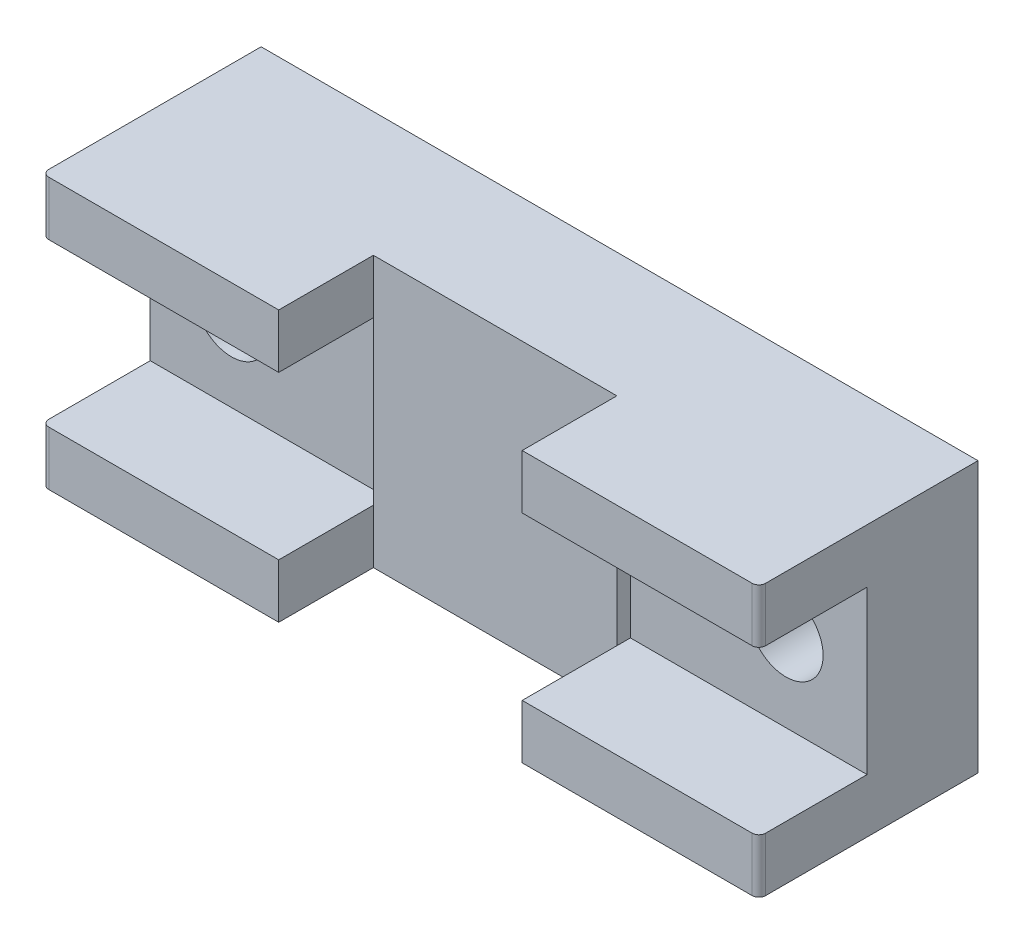
ISO-10303-21;
HEADER;
FILE_DESCRIPTION(('STEP AP214'),'2;1');
FILE_NAME('part.step','',(''),(''),'','','');
FILE_SCHEMA(('AUTOMOTIVE_DESIGN { 1 0 10303 214 1 1 1 1 }'));
ENDSEC;
DATA;
#1=APPLICATION_CONTEXT('core data for automotive mechanical design processes');
#2=APPLICATION_PROTOCOL_DEFINITION('international standard','automotive_design',2000,#1);
#3=PRODUCT_CONTEXT('',#1,'mechanical');
#4=PRODUCT('Part','Part','',(#3));
#5=PRODUCT_RELATED_PRODUCT_CATEGORY('part','',(#4));
#6=PRODUCT_DEFINITION_FORMATION('','',#4);
#7=PRODUCT_DEFINITION_CONTEXT('part definition',#1,'design');
#8=PRODUCT_DEFINITION('design','',#6,#7);
#9=PRODUCT_DEFINITION_SHAPE('','',#8);
#10=(LENGTH_UNIT() NAMED_UNIT(*) SI_UNIT(.MILLI.,.METRE.));
#11=(NAMED_UNIT(*) PLANE_ANGLE_UNIT() SI_UNIT($,.RADIAN.));
#12=(NAMED_UNIT(*) SI_UNIT($,.STERADIAN.) SOLID_ANGLE_UNIT());
#13=UNCERTAINTY_MEASURE_WITH_UNIT(LENGTH_MEASURE(1.E-05),#10,'distance_accuracy_value','');
#14=(GEOMETRIC_REPRESENTATION_CONTEXT(3) GLOBAL_UNCERTAINTY_ASSIGNED_CONTEXT((#13)) GLOBAL_UNIT_ASSIGNED_CONTEXT((#10,
#11,#12)) REPRESENTATION_CONTEXT('',''));
#15=CARTESIAN_POINT('',(0.,0.,0.));
#16=DIRECTION('',(0.,0.,1.));
#17=DIRECTION('',(1.,0.,0.));
#18=AXIS2_PLACEMENT_3D('',#15,#16,#17);
#19=CARTESIAN_POINT('',(0.,0.,8.2));
#20=DIRECTION('',(0.,0.,1.));
#21=DIRECTION('',(1.,0.,0.));
#22=AXIS2_PLACEMENT_3D('',#19,#20,#21);
#23=PLANE('',#22);
#24=CARTESIAN_POINT('',(-20.5,0.,8.2));
#25=DIRECTION('',(0.,0.,1.));
#26=DIRECTION('',(-1.,0.,0.));
#27=AXIS2_PLACEMENT_3D('',#24,#25,#26);
#28=CIRCLE('',#27,2.75);
#29=CARTESIAN_POINT('',(-23.25,0.,8.2));
#30=VERTEX_POINT('',#29);
#31=EDGE_CURVE('E312',#30,#30,#28,.T.);
#32=ORIENTED_EDGE('',*,*,#31,.F.);
#33=EDGE_LOOP('',(#32));
#34=FACE_BOUND('',#33,.T.);
#35=DIRECTION('',(0.,-1.,0.));
#36=VECTOR('',#35,1.);
#37=CARTESIAN_POINT('',(-26.5,10.,8.2));
#38=LINE('',#37,#36);
#39=CARTESIAN_POINT('',(-26.5,6.,8.2));
#40=VERTEX_POINT('',#39);
#41=CARTESIAN_POINT('',(-26.5,-6.,8.2));
#42=VERTEX_POINT('',#41);
#43=EDGE_CURVE('E196',#40,#42,#38,.T.);
#44=ORIENTED_EDGE('',*,*,#43,.T.);
#45=DIRECTION('',(-1.,0.,0.));
#46=VECTOR('',#45,1.);
#47=CARTESIAN_POINT('',(-26.5,-6.,8.2));
#48=LINE('',#47,#46);
#49=CARTESIAN_POINT('',(-9.,-6.,8.2));
#50=VERTEX_POINT('',#49);
#51=EDGE_CURVE('E205',#50,#42,#48,.T.);
#52=ORIENTED_EDGE('',*,*,#51,.F.);
#53=DIRECTION('',(0.,-1.,0.));
#54=VECTOR('',#53,1.);
#55=CARTESIAN_POINT('',(-9.,10.,8.2));
#56=LINE('',#55,#54);
#57=CARTESIAN_POINT('',(-9.,6.,8.2));
#58=VERTEX_POINT('',#57);
#59=EDGE_CURVE('E333',#58,#50,#56,.T.);
#60=ORIENTED_EDGE('',*,*,#59,.F.);
#61=DIRECTION('',(1.,0.,0.));
#62=VECTOR('',#61,1.);
#63=CARTESIAN_POINT('',(-26.5,6.,8.2));
#64=LINE('',#63,#62);
#65=EDGE_CURVE('E217',#40,#58,#64,.T.);
#66=ORIENTED_EDGE('',*,*,#65,.F.);
#67=EDGE_LOOP('',(#44,#52,#60,#66));
#68=FACE_BOUND('',#67,.T.);
#69=ADVANCED_FACE('F43',(#34,#68),#23,.T.);
#70=CARTESIAN_POINT('',(-9.,10.,9.2));
#71=DIRECTION('',(1.,0.,0.));
#72=DIRECTION('',(0.,0.,-1.));
#73=AXIS2_PLACEMENT_3D('',#70,#71,#72);
#74=PLANE('',#73);
#75=DIRECTION('',(0.,0.,-1.));
#76=VECTOR('',#75,1.);
#77=CARTESIAN_POINT('',(-9.,-6.,16.2));
#78=LINE('',#77,#76);
#79=CARTESIAN_POINT('',(-9.,-6.,9.2));
#80=VERTEX_POINT('',#79);
#81=EDGE_CURVE('E209',#80,#50,#78,.T.);
#82=ORIENTED_EDGE('',*,*,#81,.F.);
#83=DIRECTION('',(0.,-1.,0.));
#84=VECTOR('',#83,1.);
#85=CARTESIAN_POINT('',(-9.,10.,9.2));
#86=LINE('',#85,#84);
#87=CARTESIAN_POINT('',(-9.,6.,9.2));
#88=VERTEX_POINT('',#87);
#89=EDGE_CURVE('E329',#88,#80,#86,.T.);
#90=ORIENTED_EDGE('',*,*,#89,.F.);
#91=DIRECTION('',(0.,0.,-1.));
#92=VECTOR('',#91,1.);
#93=CARTESIAN_POINT('',(-9.,6.,16.2));
#94=LINE('',#93,#92);
#95=EDGE_CURVE('E393',#88,#58,#94,.T.);
#96=ORIENTED_EDGE('',*,*,#95,.T.);
#97=ORIENTED_EDGE('',*,*,#59,.T.);
#98=EDGE_LOOP('',(#82,#90,#96,#97));
#99=FACE_BOUND('',#98,.T.);
#100=ADVANCED_FACE('F396',(#99),#74,.F.);
#101=CARTESIAN_POINT('',(20.5,0.,8.2));
#102=DIRECTION('',(0.,0.,1.));
#103=DIRECTION('',(1.,0.,0.));
#104=AXIS2_PLACEMENT_3D('',#101,#102,#103);
#105=CIRCLE('',#104,2.75);
#106=CARTESIAN_POINT('',(23.25,0.,8.2));
#107=VERTEX_POINT('',#106);
#108=EDGE_CURVE('E309',#107,#107,#105,.T.);
#109=ORIENTED_EDGE('',*,*,#108,.F.);
#110=EDGE_LOOP('',(#109));
#111=FACE_BOUND('',#110,.T.);
#112=DIRECTION('',(0.,1.,0.));
#113=VECTOR('',#112,1.);
#114=CARTESIAN_POINT('',(26.5,10.,8.2));
#115=LINE('',#114,#113);
#116=CARTESIAN_POINT('',(26.5,-6.,8.2));
#117=VERTEX_POINT('',#116);
#118=CARTESIAN_POINT('',(26.5,6.,8.2));
#119=VERTEX_POINT('',#118);
#120=EDGE_CURVE('E219',#117,#119,#115,.T.);
#121=ORIENTED_EDGE('',*,*,#120,.T.);
#122=DIRECTION('',(1.,0.,0.));
#123=VECTOR('',#122,1.);
#124=CARTESIAN_POINT('',(26.5,6.,8.2));
#125=LINE('',#124,#123);
#126=CARTESIAN_POINT('',(9.,6.,8.2));
#127=VERTEX_POINT('',#126);
#128=EDGE_CURVE('E290',#127,#119,#125,.T.);
#129=ORIENTED_EDGE('',*,*,#128,.F.);
#130=DIRECTION('',(0.,1.,0.));
#131=VECTOR('',#130,1.);
#132=CARTESIAN_POINT('',(9.,10.,8.2));
#133=LINE('',#132,#131);
#134=CARTESIAN_POINT('',(9.,-6.,8.2));
#135=VERTEX_POINT('',#134);
#136=EDGE_CURVE('E308',#135,#127,#133,.T.);
#137=ORIENTED_EDGE('',*,*,#136,.F.);
#138=DIRECTION('',(-1.,0.,0.));
#139=VECTOR('',#138,1.);
#140=CARTESIAN_POINT('',(26.5,-6.,8.2));
#141=LINE('',#140,#139);
#142=EDGE_CURVE('E287',#117,#135,#141,.T.);
#143=ORIENTED_EDGE('',*,*,#142,.F.);
#144=EDGE_LOOP('',(#121,#129,#137,#143));
#145=FACE_BOUND('',#144,.T.);
#146=ADVANCED_FACE('F411',(#111,#145),#23,.T.);
#147=CARTESIAN_POINT('',(9.,10.,9.2));
#148=DIRECTION('',(-1.,0.,0.));
#149=DIRECTION('',(0.,0.,1.));
#150=AXIS2_PLACEMENT_3D('',#147,#148,#149);
#151=PLANE('',#150);
#152=DIRECTION('',(0.,0.,-1.));
#153=VECTOR('',#152,1.);
#154=CARTESIAN_POINT('',(9.,6.,16.2));
#155=LINE('',#154,#153);
#156=CARTESIAN_POINT('',(9.,6.,9.2));
#157=VERTEX_POINT('',#156);
#158=EDGE_CURVE('E347',#157,#127,#155,.T.);
#159=ORIENTED_EDGE('',*,*,#158,.F.);
#160=DIRECTION('',(0.,1.,0.));
#161=VECTOR('',#160,1.);
#162=CARTESIAN_POINT('',(9.,10.,9.2));
#163=LINE('',#162,#161);
#164=CARTESIAN_POINT('',(9.,-6.,9.2));
#165=VERTEX_POINT('',#164);
#166=EDGE_CURVE('E321',#165,#157,#163,.T.);
#167=ORIENTED_EDGE('',*,*,#166,.F.);
#168=DIRECTION('',(0.,0.,-1.));
#169=VECTOR('',#168,1.);
#170=CARTESIAN_POINT('',(9.,-6.,16.2));
#171=LINE('',#170,#169);
#172=EDGE_CURVE('E300',#165,#135,#171,.T.);
#173=ORIENTED_EDGE('',*,*,#172,.T.);
#174=ORIENTED_EDGE('',*,*,#136,.T.);
#175=EDGE_LOOP('',(#159,#167,#173,#174));
#176=FACE_BOUND('',#175,.T.);
#177=ADVANCED_FACE('F345',(#176),#151,.F.);
#178=CARTESIAN_POINT('',(26.5,10.,8.2));
#179=DIRECTION('',(-1.,0.,0.));
#180=DIRECTION('',(0.,-1.,0.));
#181=AXIS2_PLACEMENT_3D('',#178,#179,#180);
#182=PLANE('',#181);
#183=DIRECTION('',(0.,0.,-1.));
#184=VECTOR('',#183,1.);
#185=CARTESIAN_POINT('',(26.5,10.,8.2));
#186=LINE('',#185,#184);
#187=CARTESIAN_POINT('',(26.5,10.,15.7));
#188=VERTEX_POINT('',#187);
#189=CARTESIAN_POINT('',(26.5,10.,0.));
#190=VERTEX_POINT('',#189);
#191=EDGE_CURVE('E243',#188,#190,#186,.T.);
#192=ORIENTED_EDGE('',*,*,#191,.F.);
#193=DIRECTION('',(0.,1.,0.));
#194=VECTOR('',#193,1.);
#195=CARTESIAN_POINT('',(26.5,6.,15.7));
#196=LINE('',#195,#194);
#197=CARTESIAN_POINT('',(26.5,6.,15.7));
#198=VERTEX_POINT('',#197);
#199=EDGE_CURVE('E271',#188,#198,#196,.F.);
#200=ORIENTED_EDGE('',*,*,#199,.T.);
#201=DIRECTION('',(0.,0.,-1.));
#202=VECTOR('',#201,1.);
#203=CARTESIAN_POINT('',(26.5,6.,16.2));
#204=LINE('',#203,#202);
#205=EDGE_CURVE('E355',#198,#119,#204,.T.);
#206=ORIENTED_EDGE('',*,*,#205,.T.);
#207=ORIENTED_EDGE('',*,*,#120,.F.);
#208=DIRECTION('',(0.,0.,-1.));
#209=VECTOR('',#208,1.);
#210=CARTESIAN_POINT('',(26.5,-6.,16.2));
#211=LINE('',#210,#209);
#212=CARTESIAN_POINT('',(26.5,-6.,15.7));
#213=VERTEX_POINT('',#212);
#214=EDGE_CURVE('E302',#213,#117,#211,.T.);
#215=ORIENTED_EDGE('',*,*,#214,.F.);
#216=DIRECTION('',(0.,1.,0.));
#217=VECTOR('',#216,1.);
#218=CARTESIAN_POINT('',(26.5,-10.,15.7));
#219=LINE('',#218,#217);
#220=CARTESIAN_POINT('',(26.5,-10.,15.7));
#221=VERTEX_POINT('',#220);
#222=EDGE_CURVE('E269',#213,#221,#219,.F.);
#223=ORIENTED_EDGE('',*,*,#222,.T.);
#224=DIRECTION('',(0.,0.,-1.));
#225=VECTOR('',#224,1.);
#226=CARTESIAN_POINT('',(26.5,-10.,8.2));
#227=LINE('',#226,#225);
#228=CARTESIAN_POINT('',(26.5,-10.,0.));
#229=VERTEX_POINT('',#228);
#230=EDGE_CURVE('E218',#221,#229,#227,.T.);
#231=ORIENTED_EDGE('',*,*,#230,.T.);
#232=DIRECTION('',(0.,1.,0.));
#233=VECTOR('',#232,1.);
#234=CARTESIAN_POINT('',(26.5,10.,0.));
#235=LINE('',#234,#233);
#236=EDGE_CURVE('E228',#229,#190,#235,.T.);
#237=ORIENTED_EDGE('',*,*,#236,.T.);
#238=EDGE_LOOP('',(#192,#200,#206,#207,#215,#223,#231,#237));
#239=FACE_BOUND('',#238,.T.);
#240=ADVANCED_FACE('F414',(#239),#182,.F.);
#241=CARTESIAN_POINT('',(-26.5,10.,8.2));
#242=DIRECTION('',(0.,-1.,0.));
#243=DIRECTION('',(0.,0.,-1.));
#244=AXIS2_PLACEMENT_3D('',#241,#242,#243);
#245=PLANE('',#244);
#246=DIRECTION('',(0.,0.,-1.));
#247=VECTOR('',#246,1.);
#248=CARTESIAN_POINT('',(-26.5,10.,8.2));
#249=LINE('',#248,#247);
#250=CARTESIAN_POINT('',(-26.5,10.,15.7));
#251=VERTEX_POINT('',#250);
#252=CARTESIAN_POINT('',(-26.5,10.,0.));
#253=VERTEX_POINT('',#252);
#254=EDGE_CURVE('E241',#251,#253,#249,.T.);
#255=ORIENTED_EDGE('',*,*,#254,.F.);
#256=CARTESIAN_POINT('',(-26.,10.,15.7));
#257=DIRECTION('',(0.,-1.,0.));
#258=DIRECTION('',(0.,0.,-1.));
#259=AXIS2_PLACEMENT_3D('',#256,#257,#258);
#260=CIRCLE('',#259,0.5);
#261=CARTESIAN_POINT('',(-26.,10.,16.2));
#262=VERTEX_POINT('',#261);
#263=EDGE_CURVE('E264',#251,#262,#260,.F.);
#264=ORIENTED_EDGE('',*,*,#263,.T.);
#265=DIRECTION('',(-1.,0.,0.));
#266=VECTOR('',#265,1.);
#267=CARTESIAN_POINT('',(-26.5,10.,16.2));
#268=LINE('',#267,#266);
#269=CARTESIAN_POINT('',(-9.,10.,16.2));
#270=VERTEX_POINT('',#269);
#271=EDGE_CURVE('E506',#270,#262,#268,.T.);
#272=ORIENTED_EDGE('',*,*,#271,.F.);
#273=DIRECTION('',(0.,0.,-1.));
#274=VECTOR('',#273,1.);
#275=CARTESIAN_POINT('',(-9.,10.,16.2));
#276=LINE('',#275,#274);
#277=CARTESIAN_POINT('',(-9.,10.,9.2));
#278=VERTEX_POINT('',#277);
#279=EDGE_CURVE('E380',#270,#278,#276,.T.);
#280=ORIENTED_EDGE('',*,*,#279,.T.);
#281=DIRECTION('',(-1.,0.,0.));
#282=VECTOR('',#281,1.);
#283=CARTESIAN_POINT('',(-9.,10.,9.2));
#284=LINE('',#283,#282);
#285=CARTESIAN_POINT('',(9.,10.,9.2));
#286=VERTEX_POINT('',#285);
#287=EDGE_CURVE('E320',#286,#278,#284,.T.);
#288=ORIENTED_EDGE('',*,*,#287,.F.);
#289=DIRECTION('',(0.,0.,-1.));
#290=VECTOR('',#289,1.);
#291=CARTESIAN_POINT('',(9.,10.,16.2));
#292=LINE('',#291,#290);
#293=CARTESIAN_POINT('',(9.,10.,16.2));
#294=VERTEX_POINT('',#293);
#295=EDGE_CURVE('E353',#294,#286,#292,.T.);
#296=ORIENTED_EDGE('',*,*,#295,.F.);
#297=DIRECTION('',(-1.,0.,0.));
#298=VECTOR('',#297,1.);
#299=CARTESIAN_POINT('',(26.5,10.,16.2));
#300=LINE('',#299,#298);
#301=CARTESIAN_POINT('',(26.,10.,16.2));
#302=VERTEX_POINT('',#301);
#303=EDGE_CURVE('E293',#302,#294,#300,.T.);
#304=ORIENTED_EDGE('',*,*,#303,.F.);
#305=CARTESIAN_POINT('',(26.,10.,15.7));
#306=DIRECTION('',(0.,-1.,0.));
#307=DIRECTION('',(0.,0.,-1.));
#308=AXIS2_PLACEMENT_3D('',#305,#306,#307);
#309=CIRCLE('',#308,0.5);
#310=EDGE_CURVE('E262',#302,#188,#309,.F.);
#311=ORIENTED_EDGE('',*,*,#310,.T.);
#312=ORIENTED_EDGE('',*,*,#191,.T.);
#313=DIRECTION('',(-1.,0.,0.));
#314=VECTOR('',#313,1.);
#315=CARTESIAN_POINT('',(-26.5,10.,0.));
#316=LINE('',#315,#314);
#317=EDGE_CURVE('E231',#190,#253,#316,.T.);
#318=ORIENTED_EDGE('',*,*,#317,.T.);
#319=EDGE_LOOP('',(#255,#264,#272,#280,#288,#296,#304,#311,#312,#318));
#320=FACE_BOUND('',#319,.T.);
#321=ADVANCED_FACE('F376',(#320),#245,.F.);
#322=CARTESIAN_POINT('',(-26.5,10.,8.2));
#323=DIRECTION('',(1.,0.,0.));
#324=DIRECTION('',(0.,1.,0.));
#325=AXIS2_PLACEMENT_3D('',#322,#323,#324);
#326=PLANE('',#325);
#327=DIRECTION('',(0.,0.,-1.));
#328=VECTOR('',#327,1.);
#329=CARTESIAN_POINT('',(-26.5,-10.,8.2));
#330=LINE('',#329,#328);
#331=CARTESIAN_POINT('',(-26.5,-10.,15.7));
#332=VERTEX_POINT('',#331);
#333=CARTESIAN_POINT('',(-26.5,-10.,0.));
#334=VERTEX_POINT('',#333);
#335=EDGE_CURVE('E221',#332,#334,#330,.T.);
#336=ORIENTED_EDGE('',*,*,#335,.F.);
#337=DIRECTION('',(0.,-1.,0.));
#338=VECTOR('',#337,1.);
#339=CARTESIAN_POINT('',(-26.5,-6.,15.7));
#340=LINE('',#339,#338);
#341=CARTESIAN_POINT('',(-26.5,-6.,15.7));
#342=VERTEX_POINT('',#341);
#343=EDGE_CURVE('E198',#332,#342,#340,.F.);
#344=ORIENTED_EDGE('',*,*,#343,.T.);
#345=DIRECTION('',(0.,0.,-1.));
#346=VECTOR('',#345,1.);
#347=CARTESIAN_POINT('',(-26.5,-6.,16.2));
#348=LINE('',#347,#346);
#349=EDGE_CURVE('E190',#342,#42,#348,.T.);
#350=ORIENTED_EDGE('',*,*,#349,.T.);
#351=ORIENTED_EDGE('',*,*,#43,.F.);
#352=DIRECTION('',(0.,0.,-1.));
#353=VECTOR('',#352,1.);
#354=CARTESIAN_POINT('',(-26.5,6.,16.2));
#355=LINE('',#354,#353);
#356=CARTESIAN_POINT('',(-26.5,6.,15.7));
#357=VERTEX_POINT('',#356);
#358=EDGE_CURVE('E213',#357,#40,#355,.T.);
#359=ORIENTED_EDGE('',*,*,#358,.F.);
#360=DIRECTION('',(0.,-1.,0.));
#361=VECTOR('',#360,1.);
#362=CARTESIAN_POINT('',(-26.5,10.,15.7));
#363=LINE('',#362,#361);
#364=EDGE_CURVE('E252',#357,#251,#363,.F.);
#365=ORIENTED_EDGE('',*,*,#364,.T.);
#366=ORIENTED_EDGE('',*,*,#254,.T.);
#367=DIRECTION('',(0.,-1.,0.));
#368=VECTOR('',#367,1.);
#369=CARTESIAN_POINT('',(-26.5,10.,0.));
#370=LINE('',#369,#368);
#371=EDGE_CURVE('E235',#253,#334,#370,.T.);
#372=ORIENTED_EDGE('',*,*,#371,.T.);
#373=EDGE_LOOP('',(#336,#344,#350,#351,#359,#365,#366,#372));
#374=FACE_BOUND('',#373,.T.);
#375=ADVANCED_FACE('F193',(#374),#326,.F.);
#376=CARTESIAN_POINT('',(-26.5,-10.,8.2));
#377=DIRECTION('',(0.,1.,0.));
#378=DIRECTION('',(0.,0.,1.));
#379=AXIS2_PLACEMENT_3D('',#376,#377,#378);
#380=PLANE('',#379);
#381=DIRECTION('',(1.,0.,0.));
#382=VECTOR('',#381,1.);
#383=CARTESIAN_POINT('',(-26.5,-10.,16.2));
#384=LINE('',#383,#382);
#385=CARTESIAN_POINT('',(-26.,-10.,16.2));
#386=VERTEX_POINT('',#385);
#387=CARTESIAN_POINT('',(-9.,-10.,16.2));
#388=VERTEX_POINT('',#387);
#389=EDGE_CURVE('E214',#386,#388,#384,.T.);
#390=ORIENTED_EDGE('',*,*,#389,.F.);
#391=CARTESIAN_POINT('',(-26.,-10.,15.7));
#392=DIRECTION('',(0.,1.,0.));
#393=DIRECTION('',(0.,0.,1.));
#394=AXIS2_PLACEMENT_3D('',#391,#392,#393);
#395=CIRCLE('',#394,0.5);
#396=EDGE_CURVE('E250',#386,#332,#395,.F.);
#397=ORIENTED_EDGE('',*,*,#396,.T.);
#398=ORIENTED_EDGE('',*,*,#335,.T.);
#399=DIRECTION('',(1.,0.,0.));
#400=VECTOR('',#399,1.);
#401=CARTESIAN_POINT('',(-26.5,-10.,0.));
#402=LINE('',#401,#400);
#403=EDGE_CURVE('E224',#334,#229,#402,.T.);
#404=ORIENTED_EDGE('',*,*,#403,.T.);
#405=ORIENTED_EDGE('',*,*,#230,.F.);
#406=CARTESIAN_POINT('',(26.,-10.,15.7));
#407=DIRECTION('',(0.,1.,0.));
#408=DIRECTION('',(0.,0.,1.));
#409=AXIS2_PLACEMENT_3D('',#406,#407,#408);
#410=CIRCLE('',#409,0.5);
#411=CARTESIAN_POINT('',(26.,-10.,16.2));
#412=VERTEX_POINT('',#411);
#413=EDGE_CURVE('E248',#221,#412,#410,.F.);
#414=ORIENTED_EDGE('',*,*,#413,.T.);
#415=DIRECTION('',(1.,0.,0.));
#416=VECTOR('',#415,1.);
#417=CARTESIAN_POINT('',(26.5,-10.,16.2));
#418=LINE('',#417,#416);
#419=CARTESIAN_POINT('',(9.,-10.,16.2));
#420=VERTEX_POINT('',#419);
#421=EDGE_CURVE('E280',#420,#412,#418,.T.);
#422=ORIENTED_EDGE('',*,*,#421,.F.);
#423=DIRECTION('',(0.,0.,-1.));
#424=VECTOR('',#423,1.);
#425=CARTESIAN_POINT('',(9.,-10.,16.2));
#426=LINE('',#425,#424);
#427=CARTESIAN_POINT('',(9.,-10.,9.2));
#428=VERTEX_POINT('',#427);
#429=EDGE_CURVE('E296',#420,#428,#426,.T.);
#430=ORIENTED_EDGE('',*,*,#429,.T.);
#431=DIRECTION('',(1.,0.,0.));
#432=VECTOR('',#431,1.);
#433=CARTESIAN_POINT('',(-9.,-10.,9.2));
#434=LINE('',#433,#432);
#435=CARTESIAN_POINT('',(-9.,-10.,9.2));
#436=VERTEX_POINT('',#435);
#437=EDGE_CURVE('E232',#436,#428,#434,.T.);
#438=ORIENTED_EDGE('',*,*,#437,.F.);
#439=DIRECTION('',(0.,0.,-1.));
#440=VECTOR('',#439,1.);
#441=CARTESIAN_POINT('',(-9.,-10.,16.2));
#442=LINE('',#441,#440);
#443=EDGE_CURVE('E404',#388,#436,#442,.T.);
#444=ORIENTED_EDGE('',*,*,#443,.F.);
#445=EDGE_LOOP('',(#390,#397,#398,#404,#405,#414,#422,#430,#438,#444));
#446=FACE_BOUND('',#445,.T.);
#447=ADVANCED_FACE('F403',(#446),#380,.F.);
#448=CARTESIAN_POINT('',(0.,0.,0.));
#449=DIRECTION('',(0.,0.,1.));
#450=DIRECTION('',(1.,0.,0.));
#451=AXIS2_PLACEMENT_3D('',#448,#449,#450);
#452=PLANE('',#451);
#453=CARTESIAN_POINT('',(20.5,0.,0.));
#454=DIRECTION('',(0.,0.,1.));
#455=DIRECTION('',(1.,0.,0.));
#456=AXIS2_PLACEMENT_3D('',#453,#454,#455);
#457=CIRCLE('',#456,2.75);
#458=CARTESIAN_POINT('',(23.25,0.,0.));
#459=VERTEX_POINT('',#458);
#460=EDGE_CURVE('E305',#459,#459,#457,.T.);
#461=ORIENTED_EDGE('',*,*,#460,.T.);
#462=EDGE_LOOP('',(#461));
#463=FACE_BOUND('',#462,.T.);
#464=CARTESIAN_POINT('',(-20.5,0.,0.));
#465=DIRECTION('',(0.,0.,1.));
#466=DIRECTION('',(-1.,0.,0.));
#467=AXIS2_PLACEMENT_3D('',#464,#465,#466);
#468=CIRCLE('',#467,2.75);
#469=CARTESIAN_POINT('',(-23.25,0.,0.));
#470=VERTEX_POINT('',#469);
#471=EDGE_CURVE('E304',#470,#470,#468,.T.);
#472=ORIENTED_EDGE('',*,*,#471,.T.);
#473=EDGE_LOOP('',(#472));
#474=FACE_BOUND('',#473,.T.);
#475=ORIENTED_EDGE('',*,*,#236,.F.);
#476=ORIENTED_EDGE('',*,*,#403,.F.);
#477=ORIENTED_EDGE('',*,*,#371,.F.);
#478=ORIENTED_EDGE('',*,*,#317,.F.);
#479=EDGE_LOOP('',(#475,#476,#477,#478));
#480=FACE_BOUND('',#479,.T.);
#481=ADVANCED_FACE('F461',(#463,#474,#480),#452,.F.);
#482=CARTESIAN_POINT('',(0.,0.,9.2));
#483=DIRECTION('',(0.,0.,1.));
#484=DIRECTION('',(1.,0.,0.));
#485=AXIS2_PLACEMENT_3D('',#482,#483,#484);
#486=PLANE('',#485);
#487=EDGE_CURVE('E317',#428,#165,#163,.T.);
#488=ORIENTED_EDGE('',*,*,#487,.T.);
#489=ORIENTED_EDGE('',*,*,#166,.T.);
#490=EDGE_CURVE('E322',#157,#286,#163,.T.);
#491=ORIENTED_EDGE('',*,*,#490,.T.);
#492=ORIENTED_EDGE('',*,*,#287,.T.);
#493=EDGE_CURVE('E326',#278,#88,#86,.T.);
#494=ORIENTED_EDGE('',*,*,#493,.T.);
#495=ORIENTED_EDGE('',*,*,#89,.T.);
#496=EDGE_CURVE('E325',#80,#436,#86,.T.);
#497=ORIENTED_EDGE('',*,*,#496,.T.);
#498=ORIENTED_EDGE('',*,*,#437,.T.);
#499=EDGE_LOOP('',(#488,#489,#491,#492,#494,#495,#497,#498));
#500=FACE_BOUND('',#499,.T.);
#501=ADVANCED_FACE('F341',(#500),#486,.T.);
#502=CARTESIAN_POINT('',(-20.5,0.,0.));
#503=DIRECTION('',(0.,0.,1.));
#504=DIRECTION('',(1.,0.,0.));
#505=AXIS2_PLACEMENT_3D('',#502,#503,#504);
#506=CYLINDRICAL_SURFACE('',#505,2.75);
#507=ORIENTED_EDGE('',*,*,#471,.F.);
#508=EDGE_LOOP('',(#507));
#509=FACE_BOUND('',#508,.T.);
#510=ORIENTED_EDGE('',*,*,#31,.T.);
#511=EDGE_LOOP('',(#510));
#512=FACE_BOUND('',#511,.T.);
#513=ADVANCED_FACE('F447',(#509,#512),#506,.F.);
#514=CARTESIAN_POINT('',(20.5,0.,0.));
#515=DIRECTION('',(0.,0.,1.));
#516=DIRECTION('',(1.,0.,0.));
#517=AXIS2_PLACEMENT_3D('',#514,#515,#516);
#518=CYLINDRICAL_SURFACE('',#517,2.75);
#519=ORIENTED_EDGE('',*,*,#460,.F.);
#520=EDGE_LOOP('',(#519));
#521=FACE_BOUND('',#520,.T.);
#522=ORIENTED_EDGE('',*,*,#108,.T.);
#523=EDGE_LOOP('',(#522));
#524=FACE_BOUND('',#523,.T.);
#525=ADVANCED_FACE('F445',(#521,#524),#518,.F.);
#526=CARTESIAN_POINT('',(26.5,-6.,16.2));
#527=DIRECTION('',(0.,-1.,0.));
#528=DIRECTION('',(1.,0.,0.));
#529=AXIS2_PLACEMENT_3D('',#526,#527,#528);
#530=PLANE('',#529);
#531=DIRECTION('',(-1.,0.,0.));
#532=VECTOR('',#531,1.);
#533=CARTESIAN_POINT('',(26.5,-6.,16.2));
#534=LINE('',#533,#532);
#535=CARTESIAN_POINT('',(26.,-6.,16.2));
#536=VERTEX_POINT('',#535);
#537=CARTESIAN_POINT('',(9.,-6.,16.2));
#538=VERTEX_POINT('',#537);
#539=EDGE_CURVE('E277',#536,#538,#534,.T.);
#540=ORIENTED_EDGE('',*,*,#539,.F.);
#541=CARTESIAN_POINT('',(26.,-6.,15.7));
#542=DIRECTION('',(0.,-1.,0.));
#543=DIRECTION('',(1.,0.,0.));
#544=AXIS2_PLACEMENT_3D('',#541,#542,#543);
#545=CIRCLE('',#544,0.5);
#546=EDGE_CURVE('E11',#536,#213,#545,.F.);
#547=ORIENTED_EDGE('',*,*,#546,.T.);
#548=ORIENTED_EDGE('',*,*,#214,.T.);
#549=ORIENTED_EDGE('',*,*,#142,.T.);
#550=ORIENTED_EDGE('',*,*,#172,.F.);
#551=EDGE_CURVE('E284',#538,#165,#171,.T.);
#552=ORIENTED_EDGE('',*,*,#551,.F.);
#553=EDGE_LOOP('',(#540,#547,#548,#549,#550,#552));
#554=FACE_BOUND('',#553,.T.);
#555=ADVANCED_FACE('F282',(#554),#530,.F.);
#556=CARTESIAN_POINT('',(9.,-10.,16.2));
#557=DIRECTION('',(1.,0.,0.));
#558=DIRECTION('',(0.,0.,-1.));
#559=AXIS2_PLACEMENT_3D('',#556,#557,#558);
#560=PLANE('',#559);
#561=ORIENTED_EDGE('',*,*,#487,.F.);
#562=ORIENTED_EDGE('',*,*,#429,.F.);
#563=DIRECTION('',(0.,-1.,0.));
#564=VECTOR('',#563,1.);
#565=CARTESIAN_POINT('',(9.,-10.,16.2));
#566=LINE('',#565,#564);
#567=EDGE_CURVE('E286',#538,#420,#566,.T.);
#568=ORIENTED_EDGE('',*,*,#567,.F.);
#569=ORIENTED_EDGE('',*,*,#551,.T.);
#570=EDGE_LOOP('',(#561,#562,#568,#569));
#571=FACE_BOUND('',#570,.T.);
#572=ADVANCED_FACE('F407',(#571),#560,.F.);
#573=CARTESIAN_POINT('',(0.,0.,16.2));
#574=DIRECTION('',(0.,0.,1.));
#575=DIRECTION('',(1.,0.,0.));
#576=AXIS2_PLACEMENT_3D('',#573,#574,#575);
#577=PLANE('',#576);
#578=ORIENTED_EDGE('',*,*,#421,.T.);
#579=DIRECTION('',(0.,1.,0.));
#580=VECTOR('',#579,1.);
#581=CARTESIAN_POINT('',(26.,-6.,16.2));
#582=LINE('',#581,#580);
#583=EDGE_CURVE('E51',#412,#536,#582,.T.);
#584=ORIENTED_EDGE('',*,*,#583,.T.);
#585=ORIENTED_EDGE('',*,*,#539,.T.);
#586=ORIENTED_EDGE('',*,*,#567,.T.);
#587=EDGE_LOOP('',(#578,#584,#585,#586));
#588=FACE_BOUND('',#587,.T.);
#589=ADVANCED_FACE('F276',(#588),#577,.T.);
#590=CARTESIAN_POINT('',(9.,10.,16.2));
#591=DIRECTION('',(1.,0.,0.));
#592=DIRECTION('',(0.,0.,-1.));
#593=AXIS2_PLACEMENT_3D('',#590,#591,#592);
#594=PLANE('',#593);
#595=ORIENTED_EDGE('',*,*,#490,.F.);
#596=CARTESIAN_POINT('',(9.,6.,16.2));
#597=VERTEX_POINT('',#596);
#598=EDGE_CURVE('E352',#597,#157,#155,.T.);
#599=ORIENTED_EDGE('',*,*,#598,.F.);
#600=DIRECTION('',(0.,-1.,0.));
#601=VECTOR('',#600,1.);
#602=CARTESIAN_POINT('',(9.,10.,16.2));
#603=LINE('',#602,#601);
#604=EDGE_CURVE('E363',#294,#597,#603,.T.);
#605=ORIENTED_EDGE('',*,*,#604,.F.);
#606=ORIENTED_EDGE('',*,*,#295,.T.);
#607=EDGE_LOOP('',(#595,#599,#605,#606));
#608=FACE_BOUND('',#607,.T.);
#609=ADVANCED_FACE('F373',(#608),#594,.F.);
#610=CARTESIAN_POINT('',(26.5,6.,16.2));
#611=DIRECTION('',(0.,1.,0.));
#612=DIRECTION('',(-1.,0.,0.));
#613=AXIS2_PLACEMENT_3D('',#610,#611,#612);
#614=PLANE('',#613);
#615=ORIENTED_EDGE('',*,*,#205,.F.);
#616=CARTESIAN_POINT('',(26.,6.,15.7));
#617=DIRECTION('',(0.,1.,0.));
#618=DIRECTION('',(-1.,0.,0.));
#619=AXIS2_PLACEMENT_3D('',#616,#617,#618);
#620=CIRCLE('',#619,0.5);
#621=CARTESIAN_POINT('',(26.,6.,16.2));
#622=VERTEX_POINT('',#621);
#623=EDGE_CURVE('E273',#198,#622,#620,.F.);
#624=ORIENTED_EDGE('',*,*,#623,.T.);
#625=DIRECTION('',(1.,0.,0.));
#626=VECTOR('',#625,1.);
#627=CARTESIAN_POINT('',(26.5,6.,16.2));
#628=LINE('',#627,#626);
#629=EDGE_CURVE('E360',#597,#622,#628,.T.);
#630=ORIENTED_EDGE('',*,*,#629,.F.);
#631=ORIENTED_EDGE('',*,*,#598,.T.);
#632=ORIENTED_EDGE('',*,*,#158,.T.);
#633=ORIENTED_EDGE('',*,*,#128,.T.);
#634=EDGE_LOOP('',(#615,#624,#630,#631,#632,#633));
#635=FACE_BOUND('',#634,.T.);
#636=ADVANCED_FACE('F418',(#635),#614,.F.);
#637=CARTESIAN_POINT('',(0.,0.,16.2));
#638=DIRECTION('',(0.,0.,1.));
#639=DIRECTION('',(1.,0.,0.));
#640=AXIS2_PLACEMENT_3D('',#637,#638,#639);
#641=PLANE('',#640);
#642=ORIENTED_EDGE('',*,*,#629,.T.);
#643=DIRECTION('',(0.,1.,0.));
#644=VECTOR('',#643,1.);
#645=CARTESIAN_POINT('',(26.,10.,16.2));
#646=LINE('',#645,#644);
#647=EDGE_CURVE('E266',#622,#302,#646,.T.);
#648=ORIENTED_EDGE('',*,*,#647,.T.);
#649=ORIENTED_EDGE('',*,*,#303,.T.);
#650=ORIENTED_EDGE('',*,*,#604,.T.);
#651=EDGE_LOOP('',(#642,#648,#649,#650));
#652=FACE_BOUND('',#651,.T.);
#653=ADVANCED_FACE('F368',(#652),#641,.T.);
#654=CARTESIAN_POINT('',(-26.5,6.,16.2));
#655=DIRECTION('',(0.,1.,0.));
#656=DIRECTION('',(-1.,0.,0.));
#657=AXIS2_PLACEMENT_3D('',#654,#655,#656);
#658=PLANE('',#657);
#659=DIRECTION('',(1.,0.,0.));
#660=VECTOR('',#659,1.);
#661=CARTESIAN_POINT('',(-26.5,6.,16.2));
#662=LINE('',#661,#660);
#663=CARTESIAN_POINT('',(-26.,6.,16.2));
#664=VERTEX_POINT('',#663);
#665=CARTESIAN_POINT('',(-9.,6.,16.2));
#666=VERTEX_POINT('',#665);
#667=EDGE_CURVE('E505',#664,#666,#662,.T.);
#668=ORIENTED_EDGE('',*,*,#667,.F.);
#669=CARTESIAN_POINT('',(-26.,6.,15.7));
#670=DIRECTION('',(0.,1.,0.));
#671=DIRECTION('',(-1.,0.,0.));
#672=AXIS2_PLACEMENT_3D('',#669,#670,#671);
#673=CIRCLE('',#672,0.5);
#674=EDGE_CURVE('E260',#664,#357,#673,.F.);
#675=ORIENTED_EDGE('',*,*,#674,.T.);
#676=ORIENTED_EDGE('',*,*,#358,.T.);
#677=ORIENTED_EDGE('',*,*,#65,.T.);
#678=ORIENTED_EDGE('',*,*,#95,.F.);
#679=EDGE_CURVE('E388',#666,#88,#94,.T.);
#680=ORIENTED_EDGE('',*,*,#679,.F.);
#681=EDGE_LOOP('',(#668,#675,#676,#677,#678,#680));
#682=FACE_BOUND('',#681,.T.);
#683=ADVANCED_FACE('F395',(#682),#658,.F.);
#684=CARTESIAN_POINT('',(-9.,10.,16.2));
#685=DIRECTION('',(-1.,0.,0.));
#686=DIRECTION('',(0.,0.,1.));
#687=AXIS2_PLACEMENT_3D('',#684,#685,#686);
#688=PLANE('',#687);
#689=ORIENTED_EDGE('',*,*,#493,.F.);
#690=ORIENTED_EDGE('',*,*,#279,.F.);
#691=DIRECTION('',(0.,1.,0.));
#692=VECTOR('',#691,1.);
#693=CARTESIAN_POINT('',(-9.,10.,16.2));
#694=LINE('',#693,#692);
#695=EDGE_CURVE('E390',#666,#270,#694,.T.);
#696=ORIENTED_EDGE('',*,*,#695,.F.);
#697=ORIENTED_EDGE('',*,*,#679,.T.);
#698=EDGE_LOOP('',(#689,#690,#696,#697));
#699=FACE_BOUND('',#698,.T.);
#700=ADVANCED_FACE('F385',(#699),#688,.F.);
#701=CARTESIAN_POINT('',(0.,0.,16.2));
#702=DIRECTION('',(0.,0.,1.));
#703=DIRECTION('',(1.,0.,0.));
#704=AXIS2_PLACEMENT_3D('',#701,#702,#703);
#705=PLANE('',#704);
#706=ORIENTED_EDGE('',*,*,#271,.T.);
#707=DIRECTION('',(0.,-1.,0.));
#708=VECTOR('',#707,1.);
#709=CARTESIAN_POINT('',(-26.,6.,16.2));
#710=LINE('',#709,#708);
#711=EDGE_CURVE('E257',#262,#664,#710,.T.);
#712=ORIENTED_EDGE('',*,*,#711,.T.);
#713=ORIENTED_EDGE('',*,*,#667,.T.);
#714=ORIENTED_EDGE('',*,*,#695,.T.);
#715=EDGE_LOOP('',(#706,#712,#713,#714));
#716=FACE_BOUND('',#715,.T.);
#717=ADVANCED_FACE('F504',(#716),#705,.T.);
#718=CARTESIAN_POINT('',(-9.,-10.,16.2));
#719=DIRECTION('',(-1.,0.,0.));
#720=DIRECTION('',(0.,0.,1.));
#721=AXIS2_PLACEMENT_3D('',#718,#719,#720);
#722=PLANE('',#721);
#723=ORIENTED_EDGE('',*,*,#496,.F.);
#724=CARTESIAN_POINT('',(-9.,-6.,16.2));
#725=VERTEX_POINT('',#724);
#726=EDGE_CURVE('E202',#725,#80,#78,.T.);
#727=ORIENTED_EDGE('',*,*,#726,.F.);
#728=DIRECTION('',(0.,1.,0.));
#729=VECTOR('',#728,1.);
#730=CARTESIAN_POINT('',(-9.,-10.,16.2));
#731=LINE('',#730,#729);
#732=EDGE_CURVE('E514',#388,#725,#731,.T.);
#733=ORIENTED_EDGE('',*,*,#732,.F.);
#734=ORIENTED_EDGE('',*,*,#443,.T.);
#735=EDGE_LOOP('',(#723,#727,#733,#734));
#736=FACE_BOUND('',#735,.T.);
#737=ADVANCED_FACE('F520',(#736),#722,.F.);
#738=CARTESIAN_POINT('',(-26.5,-6.,16.2));
#739=DIRECTION('',(0.,-1.,0.));
#740=DIRECTION('',(1.,0.,0.));
#741=AXIS2_PLACEMENT_3D('',#738,#739,#740);
#742=PLANE('',#741);
#743=ORIENTED_EDGE('',*,*,#349,.F.);
#744=CARTESIAN_POINT('',(-26.,-6.,15.7));
#745=DIRECTION('',(0.,-1.,0.));
#746=DIRECTION('',(1.,0.,0.));
#747=AXIS2_PLACEMENT_3D('',#744,#745,#746);
#748=CIRCLE('',#747,0.5);
#749=CARTESIAN_POINT('',(-26.,-6.,16.2));
#750=VERTEX_POINT('',#749);
#751=EDGE_CURVE('E255',#342,#750,#748,.F.);
#752=ORIENTED_EDGE('',*,*,#751,.T.);
#753=DIRECTION('',(-1.,0.,0.));
#754=VECTOR('',#753,1.);
#755=CARTESIAN_POINT('',(-26.5,-6.,16.2));
#756=LINE('',#755,#754);
#757=EDGE_CURVE('E201',#725,#750,#756,.T.);
#758=ORIENTED_EDGE('',*,*,#757,.F.);
#759=ORIENTED_EDGE('',*,*,#726,.T.);
#760=ORIENTED_EDGE('',*,*,#81,.T.);
#761=ORIENTED_EDGE('',*,*,#51,.T.);
#762=EDGE_LOOP('',(#743,#752,#758,#759,#760,#761));
#763=FACE_BOUND('',#762,.T.);
#764=ADVANCED_FACE('F206',(#763),#742,.F.);
#765=CARTESIAN_POINT('',(0.,0.,16.2));
#766=DIRECTION('',(0.,0.,1.));
#767=DIRECTION('',(1.,0.,0.));
#768=AXIS2_PLACEMENT_3D('',#765,#766,#767);
#769=PLANE('',#768);
#770=ORIENTED_EDGE('',*,*,#757,.T.);
#771=DIRECTION('',(0.,-1.,0.));
#772=VECTOR('',#771,1.);
#773=CARTESIAN_POINT('',(-26.,-10.,16.2));
#774=LINE('',#773,#772);
#775=EDGE_CURVE('E245',#750,#386,#774,.T.);
#776=ORIENTED_EDGE('',*,*,#775,.T.);
#777=ORIENTED_EDGE('',*,*,#389,.T.);
#778=ORIENTED_EDGE('',*,*,#732,.T.);
#779=EDGE_LOOP('',(#770,#776,#777,#778));
#780=FACE_BOUND('',#779,.T.);
#781=ADVANCED_FACE('F483',(#780),#769,.T.);
#782=CARTESIAN_POINT('',(-26.,0.,15.7));
#783=DIRECTION('',(0.,1.,0.));
#784=DIRECTION('',(-1.,0.,0.));
#785=AXIS2_PLACEMENT_3D('',#782,#783,#784);
#786=CYLINDRICAL_SURFACE('',#785,0.5);
#787=ORIENTED_EDGE('',*,*,#751,.F.);
#788=ORIENTED_EDGE('',*,*,#343,.F.);
#789=ORIENTED_EDGE('',*,*,#396,.F.);
#790=ORIENTED_EDGE('',*,*,#775,.F.);
#791=EDGE_LOOP('',(#787,#788,#789,#790));
#792=FACE_BOUND('',#791,.T.);
#793=ADVANCED_FACE('F479',(#792),#786,.T.);
#794=CARTESIAN_POINT('',(-26.,0.,15.7));
#795=DIRECTION('',(0.,1.,0.));
#796=DIRECTION('',(-1.,0.,0.));
#797=AXIS2_PLACEMENT_3D('',#794,#795,#796);
#798=CYLINDRICAL_SURFACE('',#797,0.5);
#799=ORIENTED_EDGE('',*,*,#263,.F.);
#800=ORIENTED_EDGE('',*,*,#364,.F.);
#801=ORIENTED_EDGE('',*,*,#674,.F.);
#802=ORIENTED_EDGE('',*,*,#711,.F.);
#803=EDGE_LOOP('',(#799,#800,#801,#802));
#804=FACE_BOUND('',#803,.T.);
#805=ADVANCED_FACE('F482',(#804),#798,.T.);
#806=CARTESIAN_POINT('',(26.,0.,15.7));
#807=DIRECTION('',(0.,-1.,0.));
#808=DIRECTION('',(1.,0.,0.));
#809=AXIS2_PLACEMENT_3D('',#806,#807,#808);
#810=CYLINDRICAL_SURFACE('',#809,0.5);
#811=ORIENTED_EDGE('',*,*,#623,.F.);
#812=ORIENTED_EDGE('',*,*,#199,.F.);
#813=ORIENTED_EDGE('',*,*,#310,.F.);
#814=ORIENTED_EDGE('',*,*,#647,.F.);
#815=EDGE_LOOP('',(#811,#812,#813,#814));
#816=FACE_BOUND('',#815,.T.);
#817=ADVANCED_FACE('F486',(#816),#810,.T.);
#818=CARTESIAN_POINT('',(26.,0.,15.7));
#819=DIRECTION('',(0.,-1.,0.));
#820=DIRECTION('',(1.,0.,0.));
#821=AXIS2_PLACEMENT_3D('',#818,#819,#820);
#822=CYLINDRICAL_SURFACE('',#821,0.5);
#823=ORIENTED_EDGE('',*,*,#413,.F.);
#824=ORIENTED_EDGE('',*,*,#222,.F.);
#825=ORIENTED_EDGE('',*,*,#546,.F.);
#826=ORIENTED_EDGE('',*,*,#583,.F.);
#827=EDGE_LOOP('',(#823,#824,#825,#826));
#828=FACE_BOUND('',#827,.T.);
#829=ADVANCED_FACE('F45',(#828),#822,.T.);
#830=CLOSED_SHELL('',(#69,#100,#146,#177,#240,#321,#375,#447,#481,#501,#513,#525,#555,#572,#589,
#609,#636,#653,#683,#700,#717,#737,#764,#781,#793,#805,#817,#829));
#831=MANIFOLD_SOLID_BREP('B2',#830);
#832=ADVANCED_BREP_SHAPE_REPRESENTATION('',(#18,#831),#14);
#833=SHAPE_DEFINITION_REPRESENTATION(#9,#832);
ENDSEC;
END-ISO-10303-21;
